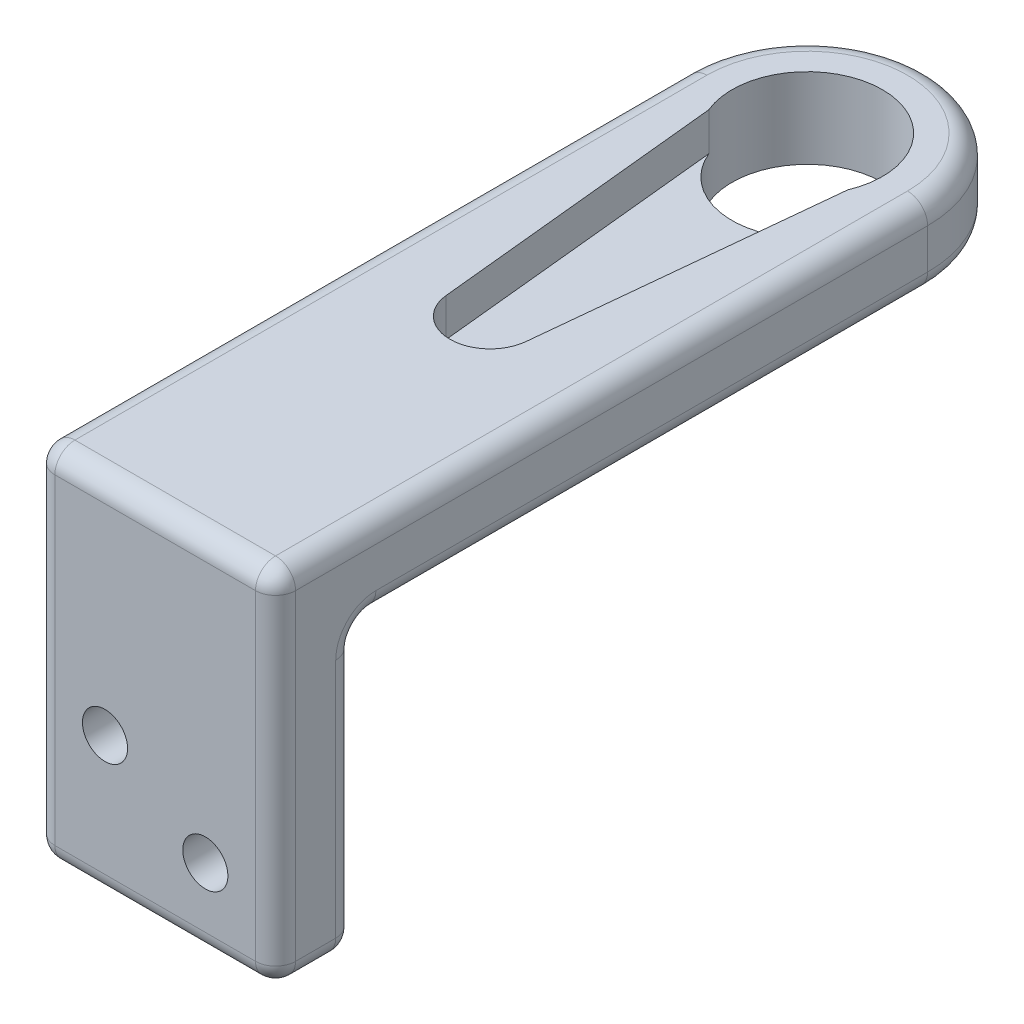
ISO-10303-21;
HEADER;
FILE_DESCRIPTION(('STEP AP214'),'2;1');
FILE_NAME('part.step','',(''),(''),'','','');
FILE_SCHEMA(('AUTOMOTIVE_DESIGN { 1 0 10303 214 1 1 1 1 }'));
ENDSEC;
DATA;
#1=APPLICATION_CONTEXT('core data for automotive mechanical design processes');
#2=APPLICATION_PROTOCOL_DEFINITION('international standard','automotive_design',2000,#1);
#3=PRODUCT_CONTEXT('',#1,'mechanical');
#4=PRODUCT('Part','Part','',(#3));
#5=PRODUCT_RELATED_PRODUCT_CATEGORY('part','',(#4));
#6=PRODUCT_DEFINITION_FORMATION('','',#4);
#7=PRODUCT_DEFINITION_CONTEXT('part definition',#1,'design');
#8=PRODUCT_DEFINITION('design','',#6,#7);
#9=PRODUCT_DEFINITION_SHAPE('','',#8);
#10=(LENGTH_UNIT() NAMED_UNIT(*) SI_UNIT(.MILLI.,.METRE.));
#11=(NAMED_UNIT(*) PLANE_ANGLE_UNIT() SI_UNIT($,.RADIAN.));
#12=(NAMED_UNIT(*) SI_UNIT($,.STERADIAN.) SOLID_ANGLE_UNIT());
#13=UNCERTAINTY_MEASURE_WITH_UNIT(LENGTH_MEASURE(1.E-05),#10,'distance_accuracy_value','');
#14=(GEOMETRIC_REPRESENTATION_CONTEXT(3) GLOBAL_UNCERTAINTY_ASSIGNED_CONTEXT((#13)) GLOBAL_UNIT_ASSIGNED_CONTEXT((#10,
#11,#12)) REPRESENTATION_CONTEXT('',''));
#15=CARTESIAN_POINT('',(0.,0.,0.));
#16=DIRECTION('',(0.,0.,1.));
#17=DIRECTION('',(1.,0.,0.));
#18=AXIS2_PLACEMENT_3D('',#15,#16,#17);
#19=CARTESIAN_POINT('',(0.,4.,0.));
#20=DIRECTION('',(0.,-1.,0.));
#21=DIRECTION('',(0.,0.,-1.));
#22=AXIS2_PLACEMENT_3D('',#19,#20,#21);
#23=CYLINDRICAL_SURFACE('',#22,6.);
#24=DIRECTION('',(0.,-1.,0.));
#25=VECTOR('',#24,1.);
#26=CARTESIAN_POINT('',(-6.,4.,0.));
#27=LINE('',#26,#25);
#28=CARTESIAN_POINT('',(-6.,3.,0.));
#29=VERTEX_POINT('',#28);
#30=CARTESIAN_POINT('',(-6.,1.,0.));
#31=VERTEX_POINT('',#30);
#32=EDGE_CURVE('E234',#29,#31,#27,.T.);
#33=ORIENTED_EDGE('',*,*,#32,.F.);
#34=CARTESIAN_POINT('',(0.,3.,0.));
#35=DIRECTION('',(0.,-1.,0.));
#36=DIRECTION('',(0.,0.,-1.));
#37=AXIS2_PLACEMENT_3D('',#34,#35,#36);
#38=CIRCLE('',#37,6.);
#39=CARTESIAN_POINT('',(6.,3.,0.));
#40=VERTEX_POINT('',#39);
#41=EDGE_CURVE('E306',#29,#40,#38,.T.);
#42=ORIENTED_EDGE('',*,*,#41,.T.);
#43=DIRECTION('',(0.,-1.,0.));
#44=VECTOR('',#43,1.);
#45=CARTESIAN_POINT('',(6.,4.,0.));
#46=LINE('',#45,#44);
#47=CARTESIAN_POINT('',(6.,1.,0.));
#48=VERTEX_POINT('',#47);
#49=EDGE_CURVE('E225',#40,#48,#46,.T.);
#50=ORIENTED_EDGE('',*,*,#49,.T.);
#51=CARTESIAN_POINT('',(0.,1.,0.));
#52=DIRECTION('',(0.,-1.,0.));
#53=DIRECTION('',(0.,0.,-1.));
#54=AXIS2_PLACEMENT_3D('',#51,#52,#53);
#55=CIRCLE('',#54,6.);
#56=EDGE_CURVE('E303',#48,#31,#55,.F.);
#57=ORIENTED_EDGE('',*,*,#56,.T.);
#58=EDGE_LOOP('',(#33,#42,#50,#57));
#59=FACE_BOUND('',#58,.T.);
#60=ADVANCED_FACE('F43',(#59),#23,.T.);
#61=CARTESIAN_POINT('',(-6.,4.,0.));
#62=DIRECTION('',(1.,0.,0.));
#63=DIRECTION('',(0.,0.,-1.));
#64=AXIS2_PLACEMENT_3D('',#61,#62,#63);
#65=PLANE('',#64);
#66=DIRECTION('',(0.,-1.,0.));
#67=VECTOR('',#66,1.);
#68=CARTESIAN_POINT('',(-5.99999999999999,4.,31.5));
#69=LINE('',#68,#67);
#70=CARTESIAN_POINT('',(-5.99999999999999,-13.,31.5));
#71=VERTEX_POINT('',#70);
#72=CARTESIAN_POINT('',(-5.99999999999999,3.,31.5));
#73=VERTEX_POINT('',#72);
#74=EDGE_CURVE('E284',#71,#73,#69,.F.);
#75=ORIENTED_EDGE('',*,*,#74,.T.);
#76=DIRECTION('',(0.,0.,1.));
#77=VECTOR('',#76,1.);
#78=CARTESIAN_POINT('',(-6.,3.,0.));
#79=LINE('',#78,#77);
#80=EDGE_CURVE('E287',#73,#29,#79,.F.);
#81=ORIENTED_EDGE('',*,*,#80,.T.);
#82=ORIENTED_EDGE('',*,*,#32,.T.);
#83=DIRECTION('',(0.,0.,1.));
#84=VECTOR('',#83,1.);
#85=CARTESIAN_POINT('',(-6.,1.,28.5));
#86=LINE('',#85,#84);
#87=CARTESIAN_POINT('',(-6.,1.,27.5));
#88=VERTEX_POINT('',#87);
#89=EDGE_CURVE('E275',#31,#88,#86,.T.);
#90=ORIENTED_EDGE('',*,*,#89,.T.);
#91=CARTESIAN_POINT('',(-6.,-0.999999999999999,27.5));
#92=DIRECTION('',(1.,0.,0.));
#93=DIRECTION('',(0.,0.,-1.));
#94=AXIS2_PLACEMENT_3D('',#91,#92,#93);
#95=CIRCLE('',#94,2.);
#96=CARTESIAN_POINT('',(-6.,-0.999999999999999,29.5));
#97=VERTEX_POINT('',#96);
#98=EDGE_CURVE('E271',#97,#88,#95,.F.);
#99=ORIENTED_EDGE('',*,*,#98,.F.);
#100=DIRECTION('',(0.,1.,0.));
#101=VECTOR('',#100,1.);
#102=CARTESIAN_POINT('',(-6.,4.,29.5));
#103=LINE('',#102,#101);
#104=CARTESIAN_POINT('',(-6.,-13.,29.5));
#105=VERTEX_POINT('',#104);
#106=EDGE_CURVE('E278',#97,#105,#103,.F.);
#107=ORIENTED_EDGE('',*,*,#106,.T.);
#108=DIRECTION('',(0.,0.,-1.));
#109=VECTOR('',#108,1.);
#110=CARTESIAN_POINT('',(-5.99999999999999,-13.,32.5));
#111=LINE('',#110,#109);
#112=EDGE_CURVE('E281',#105,#71,#111,.F.);
#113=ORIENTED_EDGE('',*,*,#112,.T.);
#114=EDGE_LOOP('',(#75,#81,#82,#90,#99,#107,#113));
#115=FACE_BOUND('',#114,.T.);
#116=ADVANCED_FACE('F506',(#115),#65,.F.);
#117=CARTESIAN_POINT('',(-5.99999999999999,4.,32.5));
#118=DIRECTION('',(0.,0.,-1.));
#119=DIRECTION('',(-1.,0.,0.));
#120=AXIS2_PLACEMENT_3D('',#117,#118,#119);
#121=PLANE('',#120);
#122=DIRECTION('',(0.,-1.,0.));
#123=VECTOR('',#122,1.);
#124=CARTESIAN_POINT('',(5.,4.,32.5));
#125=LINE('',#124,#123);
#126=CARTESIAN_POINT('',(5.,-13.,32.5));
#127=VERTEX_POINT('',#126);
#128=CARTESIAN_POINT('',(5.,3.,32.5));
#129=VERTEX_POINT('',#128);
#130=EDGE_CURVE('E328',#127,#129,#125,.F.);
#131=ORIENTED_EDGE('',*,*,#130,.T.);
#132=DIRECTION('',(1.,0.,0.));
#133=VECTOR('',#132,1.);
#134=CARTESIAN_POINT('',(-5.99999999999999,3.,32.5));
#135=LINE('',#134,#133);
#136=CARTESIAN_POINT('',(-4.99999999999999,3.,32.5));
#137=VERTEX_POINT('',#136);
#138=EDGE_CURVE('E331',#129,#137,#135,.F.);
#139=ORIENTED_EDGE('',*,*,#138,.T.);
#140=DIRECTION('',(0.,-1.,0.));
#141=VECTOR('',#140,1.);
#142=CARTESIAN_POINT('',(-4.99999999999999,4.,32.5));
#143=LINE('',#142,#141);
#144=CARTESIAN_POINT('',(-4.99999999999999,-13.,32.5));
#145=VERTEX_POINT('',#144);
#146=EDGE_CURVE('E325',#137,#145,#143,.T.);
#147=ORIENTED_EDGE('',*,*,#146,.T.);
#148=DIRECTION('',(-1.,0.,0.));
#149=VECTOR('',#148,1.);
#150=CARTESIAN_POINT('',(6.,-13.,32.5));
#151=LINE('',#150,#149);
#152=EDGE_CURVE('E322',#145,#127,#151,.F.);
#153=ORIENTED_EDGE('',*,*,#152,.T.);
#154=EDGE_LOOP('',(#131,#139,#147,#153));
#155=FACE_BOUND('',#154,.T.);
#156=CARTESIAN_POINT('',(2.5,-10.,32.5));
#157=DIRECTION('',(0.,0.,-1.));
#158=DIRECTION('',(-1.,0.,0.));
#159=AXIS2_PLACEMENT_3D('',#156,#157,#158);
#160=CIRCLE('',#159,1.125);
#161=CARTESIAN_POINT('',(1.375,-10.,32.5));
#162=VERTEX_POINT('',#161);
#163=EDGE_CURVE('E466',#162,#162,#160,.F.);
#164=ORIENTED_EDGE('',*,*,#163,.F.);
#165=EDGE_LOOP('',(#164));
#166=FACE_BOUND('',#165,.T.);
#167=CARTESIAN_POINT('',(-2.5,-7.,32.5));
#168=DIRECTION('',(0.,0.,-1.));
#169=DIRECTION('',(-1.,0.,0.));
#170=AXIS2_PLACEMENT_3D('',#167,#168,#169);
#171=CIRCLE('',#170,1.125);
#172=CARTESIAN_POINT('',(-3.625,-7.,32.5));
#173=VERTEX_POINT('',#172);
#174=EDGE_CURVE('E450',#173,#173,#171,.F.);
#175=ORIENTED_EDGE('',*,*,#174,.F.);
#176=EDGE_LOOP('',(#175));
#177=FACE_BOUND('',#176,.T.);
#178=ADVANCED_FACE('F501',(#155,#166,#177),#121,.F.);
#179=CARTESIAN_POINT('',(6.,4.,32.5));
#180=DIRECTION('',(-1.,0.,0.));
#181=DIRECTION('',(0.,0.,1.));
#182=AXIS2_PLACEMENT_3D('',#179,#180,#181);
#183=PLANE('',#182);
#184=CARTESIAN_POINT('',(6.,-0.999999999999999,27.5));
#185=DIRECTION('',(-1.,0.,0.));
#186=DIRECTION('',(0.,0.,1.));
#187=AXIS2_PLACEMENT_3D('',#184,#185,#186);
#188=CIRCLE('',#187,2.);
#189=CARTESIAN_POINT('',(6.,1.,27.5));
#190=VERTEX_POINT('',#189);
#191=CARTESIAN_POINT('',(6.,-0.999999999999999,29.5));
#192=VERTEX_POINT('',#191);
#193=EDGE_CURVE('E251',#190,#192,#188,.F.);
#194=ORIENTED_EDGE('',*,*,#193,.F.);
#195=DIRECTION('',(0.,0.,-1.));
#196=VECTOR('',#195,1.);
#197=CARTESIAN_POINT('',(6.,1.,0.));
#198=LINE('',#197,#196);
#199=EDGE_CURVE('E255',#190,#48,#198,.T.);
#200=ORIENTED_EDGE('',*,*,#199,.T.);
#201=ORIENTED_EDGE('',*,*,#49,.F.);
#202=DIRECTION('',(0.,0.,-1.));
#203=VECTOR('',#202,1.);
#204=CARTESIAN_POINT('',(6.,3.,32.5));
#205=LINE('',#204,#203);
#206=CARTESIAN_POINT('',(6.,3.,31.5));
#207=VERTEX_POINT('',#206);
#208=EDGE_CURVE('E244',#40,#207,#205,.F.);
#209=ORIENTED_EDGE('',*,*,#208,.T.);
#210=DIRECTION('',(0.,-1.,0.));
#211=VECTOR('',#210,1.);
#212=CARTESIAN_POINT('',(6.,4.,31.5));
#213=LINE('',#212,#211);
#214=CARTESIAN_POINT('',(6.,-13.,31.5));
#215=VERTEX_POINT('',#214);
#216=EDGE_CURVE('E241',#207,#215,#213,.T.);
#217=ORIENTED_EDGE('',*,*,#216,.T.);
#218=DIRECTION('',(0.,0.,1.));
#219=VECTOR('',#218,1.);
#220=CARTESIAN_POINT('',(6.,-13.,28.5));
#221=LINE('',#220,#219);
#222=CARTESIAN_POINT('',(6.,-13.,29.5));
#223=VERTEX_POINT('',#222);
#224=EDGE_CURVE('E238',#215,#223,#221,.F.);
#225=ORIENTED_EDGE('',*,*,#224,.T.);
#226=DIRECTION('',(0.,1.,0.));
#227=VECTOR('',#226,1.);
#228=CARTESIAN_POINT('',(6.,4.,29.5));
#229=LINE('',#228,#227);
#230=EDGE_CURVE('E247',#223,#192,#229,.T.);
#231=ORIENTED_EDGE('',*,*,#230,.T.);
#232=EDGE_LOOP('',(#194,#200,#201,#209,#217,#225,#231));
#233=FACE_BOUND('',#232,.T.);
#234=ADVANCED_FACE('F492',(#233),#183,.F.);
#235=CARTESIAN_POINT('',(0.,4.,0.));
#236=DIRECTION('',(0.,-1.,0.));
#237=DIRECTION('',(0.,0.,-1.));
#238=AXIS2_PLACEMENT_3D('',#235,#236,#237);
#239=PLANE('',#238);
#240=DIRECTION('',(1.,0.,0.));
#241=VECTOR('',#240,1.);
#242=CARTESIAN_POINT('',(0.,4.,31.5));
#243=LINE('',#242,#241);
#244=CARTESIAN_POINT('',(-4.99999999999999,4.,31.5));
#245=VERTEX_POINT('',#244);
#246=CARTESIAN_POINT('',(5.,4.,31.5));
#247=VERTEX_POINT('',#246);
#248=EDGE_CURVE('E293',#245,#247,#243,.T.);
#249=ORIENTED_EDGE('',*,*,#248,.T.);
#250=DIRECTION('',(0.,0.,-1.));
#251=VECTOR('',#250,1.);
#252=CARTESIAN_POINT('',(5.,4.,0.));
#253=LINE('',#252,#251);
#254=CARTESIAN_POINT('',(5.,4.,0.));
#255=VERTEX_POINT('',#254);
#256=EDGE_CURVE('E299',#247,#255,#253,.T.);
#257=ORIENTED_EDGE('',*,*,#256,.T.);
#258=CARTESIAN_POINT('',(0.,4.,0.));
#259=DIRECTION('',(0.,-1.,0.));
#260=DIRECTION('',(0.,0.,-1.));
#261=AXIS2_PLACEMENT_3D('',#258,#259,#260);
#262=CIRCLE('',#261,5.);
#263=CARTESIAN_POINT('',(-5.,4.,0.));
#264=VERTEX_POINT('',#263);
#265=EDGE_CURVE('E296',#255,#264,#262,.F.);
#266=ORIENTED_EDGE('',*,*,#265,.T.);
#267=DIRECTION('',(0.,0.,1.));
#268=VECTOR('',#267,1.);
#269=CARTESIAN_POINT('',(-5.,4.,0.));
#270=LINE('',#269,#268);
#271=EDGE_CURVE('E290',#264,#245,#270,.T.);
#272=ORIENTED_EDGE('',*,*,#271,.T.);
#273=EDGE_LOOP('',(#249,#257,#266,#272));
#274=FACE_BOUND('',#273,.T.);
#275=CARTESIAN_POINT('',(0.,4.,0.));
#276=DIRECTION('',(0.,1.,0.));
#277=DIRECTION('',(0.,0.,1.));
#278=AXIS2_PLACEMENT_3D('',#275,#276,#277);
#279=CIRCLE('',#278,3.75);
#280=CARTESIAN_POINT('',(3.45999999999994,4.,1.4459944674861));
#281=VERTEX_POINT('',#280);
#282=CARTESIAN_POINT('',(-3.46,4.,1.44599446748596));
#283=VERTEX_POINT('',#282);
#284=EDGE_CURVE('E213',#281,#283,#279,.T.);
#285=ORIENTED_EDGE('',*,*,#284,.F.);
#286=DIRECTION('',(0.1004588297189,0.,-0.994941216118575));
#287=VECTOR('',#286,1.);
#288=CARTESIAN_POINT('',(3.45999999999994,4.,1.4459944674861));
#289=LINE('',#288,#287);
#290=CARTESIAN_POINT('',(1.98988243223717,4.,16.0059944674861));
#291=VERTEX_POINT('',#290);
#292=EDGE_CURVE('E208',#291,#281,#289,.T.);
#293=ORIENTED_EDGE('',*,*,#292,.F.);
#294=CARTESIAN_POINT('',(0.,4.,15.8050768080483));
#295=DIRECTION('',(0.,1.,0.));
#296=DIRECTION('',(0.,0.,1.));
#297=AXIS2_PLACEMENT_3D('',#294,#295,#296);
#298=CIRCLE('',#297,2.00000000000002);
#299=CARTESIAN_POINT('',(-1.98988243223721,4.,16.005994467486));
#300=VERTEX_POINT('',#299);
#301=EDGE_CURVE('E474',#300,#291,#298,.T.);
#302=ORIENTED_EDGE('',*,*,#301,.F.);
#303=DIRECTION('',(0.100458829718901,0.,0.994941216118575));
#304=VECTOR('',#303,1.);
#305=CARTESIAN_POINT('',(-3.46,4.,1.44599446748596));
#306=LINE('',#305,#304);
#307=EDGE_CURVE('E471',#283,#300,#306,.T.);
#308=ORIENTED_EDGE('',*,*,#307,.F.);
#309=EDGE_LOOP('',(#285,#293,#302,#308));
#310=FACE_BOUND('',#309,.T.);
#311=ADVANCED_FACE('F489',(#274,#310),#239,.F.);
#312=CARTESIAN_POINT('',(0.,0.,0.));
#313=DIRECTION('',(0.,-1.,0.));
#314=DIRECTION('',(0.,0.,-1.));
#315=AXIS2_PLACEMENT_3D('',#312,#313,#314);
#316=PLANE('',#315);
#317=CARTESIAN_POINT('',(0.,0.,0.));
#318=DIRECTION('',(0.,-1.,0.));
#319=DIRECTION('',(0.,0.,-1.));
#320=AXIS2_PLACEMENT_3D('',#317,#318,#319);
#321=CIRCLE('',#320,5.);
#322=CARTESIAN_POINT('',(-5.,0.,0.));
#323=VERTEX_POINT('',#322);
#324=CARTESIAN_POINT('',(5.,0.,0.));
#325=VERTEX_POINT('',#324);
#326=EDGE_CURVE('E315',#323,#325,#321,.T.);
#327=ORIENTED_EDGE('',*,*,#326,.T.);
#328=DIRECTION('',(0.,0.,-1.));
#329=VECTOR('',#328,1.);
#330=CARTESIAN_POINT('',(5.,0.,28.5));
#331=LINE('',#330,#329);
#332=CARTESIAN_POINT('',(5.,0.,27.5));
#333=VERTEX_POINT('',#332);
#334=EDGE_CURVE('E318',#325,#333,#331,.F.);
#335=ORIENTED_EDGE('',*,*,#334,.T.);
#336=DIRECTION('',(1.,0.,0.));
#337=VECTOR('',#336,1.);
#338=CARTESIAN_POINT('',(0.,0.,27.5));
#339=LINE('',#338,#337);
#340=CARTESIAN_POINT('',(-5.,0.,27.5));
#341=VERTEX_POINT('',#340);
#342=EDGE_CURVE('E309',#333,#341,#339,.F.);
#343=ORIENTED_EDGE('',*,*,#342,.T.);
#344=DIRECTION('',(0.,0.,1.));
#345=VECTOR('',#344,1.);
#346=CARTESIAN_POINT('',(-5.,0.,0.));
#347=LINE('',#346,#345);
#348=EDGE_CURVE('E312',#341,#323,#347,.F.);
#349=ORIENTED_EDGE('',*,*,#348,.T.);
#350=EDGE_LOOP('',(#327,#335,#343,#349));
#351=FACE_BOUND('',#350,.T.);
#352=CARTESIAN_POINT('',(0.,0.,0.));
#353=DIRECTION('',(0.,-1.,0.));
#354=DIRECTION('',(0.,0.,-1.));
#355=AXIS2_PLACEMENT_3D('',#352,#353,#354);
#356=CIRCLE('',#355,3.75);
#357=CARTESIAN_POINT('',(0.,0.,-3.75));
#358=VERTEX_POINT('',#357);
#359=EDGE_CURVE('E226',#358,#358,#356,.F.);
#360=ORIENTED_EDGE('',*,*,#359,.T.);
#361=EDGE_LOOP('',(#360));
#362=FACE_BOUND('',#361,.T.);
#363=ADVANCED_FACE('F491',(#351,#362),#316,.T.);
#364=CARTESIAN_POINT('',(0.,-0.00100000000000013,0.));
#365=DIRECTION('',(0.,1.,0.));
#366=DIRECTION('',(0.,0.,1.));
#367=AXIS2_PLACEMENT_3D('',#364,#365,#366);
#368=CYLINDRICAL_SURFACE('',#367,3.75);
#369=ORIENTED_EDGE('',*,*,#359,.F.);
#370=EDGE_LOOP('',(#369));
#371=FACE_BOUND('',#370,.T.);
#372=CARTESIAN_POINT('',(0.,2.1,0.));
#373=DIRECTION('',(0.,-1.,0.));
#374=DIRECTION('',(0.,0.,1.));
#375=AXIS2_PLACEMENT_3D('',#372,#373,#374);
#376=CIRCLE('',#375,3.75);
#377=CARTESIAN_POINT('',(3.45999999999994,2.1,1.4459944674861));
#378=VERTEX_POINT('',#377);
#379=CARTESIAN_POINT('',(-3.46,2.1,1.44599446748596));
#380=VERTEX_POINT('',#379);
#381=EDGE_CURVE('E198',#378,#380,#376,.T.);
#382=ORIENTED_EDGE('',*,*,#381,.F.);
#383=DIRECTION('',(0.,1.,0.));
#384=VECTOR('',#383,1.);
#385=CARTESIAN_POINT('',(3.45999999999994,2.1,1.4459944674861));
#386=LINE('',#385,#384);
#387=EDGE_CURVE('E230',#378,#281,#386,.T.);
#388=ORIENTED_EDGE('',*,*,#387,.T.);
#389=ORIENTED_EDGE('',*,*,#284,.T.);
#390=DIRECTION('',(0.,1.,0.));
#391=VECTOR('',#390,1.);
#392=CARTESIAN_POINT('',(-3.46,2.1,1.44599446748596));
#393=LINE('',#392,#391);
#394=EDGE_CURVE('E190',#380,#283,#393,.T.);
#395=ORIENTED_EDGE('',*,*,#394,.F.);
#396=EDGE_LOOP('',(#382,#388,#389,#395));
#397=FACE_BOUND('',#396,.T.);
#398=ADVANCED_FACE('F211',(#371,#397),#368,.F.);
#399=CARTESIAN_POINT('',(3.45999999999994,2.1,1.4459944674861));
#400=DIRECTION('',(0.994941216118575,0.,0.1004588297189));
#401=DIRECTION('',(0.1004588297189,0.,-0.994941216118575));
#402=AXIS2_PLACEMENT_3D('',#399,#400,#401);
#403=PLANE('',#402);
#404=ORIENTED_EDGE('',*,*,#292,.T.);
#405=ORIENTED_EDGE('',*,*,#387,.F.);
#406=DIRECTION('',(0.1004588297189,0.,-0.994941216118575));
#407=VECTOR('',#406,1.);
#408=CARTESIAN_POINT('',(3.45999999999994,2.1,1.4459944674861));
#409=LINE('',#408,#407);
#410=CARTESIAN_POINT('',(1.98988243223717,2.1,16.0059944674861));
#411=VERTEX_POINT('',#410);
#412=EDGE_CURVE('E203',#411,#378,#409,.T.);
#413=ORIENTED_EDGE('',*,*,#412,.F.);
#414=DIRECTION('',(0.,1.,0.));
#415=VECTOR('',#414,1.);
#416=CARTESIAN_POINT('',(1.98988243223717,2.1,16.0059944674861));
#417=LINE('',#416,#415);
#418=EDGE_CURVE('E218',#411,#291,#417,.T.);
#419=ORIENTED_EDGE('',*,*,#418,.T.);
#420=EDGE_LOOP('',(#404,#405,#413,#419));
#421=FACE_BOUND('',#420,.T.);
#422=ADVANCED_FACE('F483',(#421),#403,.F.);
#423=CARTESIAN_POINT('',(0.,2.1,15.8050768080483));
#424=DIRECTION('',(0.,1.,0.));
#425=DIRECTION('',(0.,0.,1.));
#426=AXIS2_PLACEMENT_3D('',#423,#424,#425);
#427=CYLINDRICAL_SURFACE('',#426,2.00000000000002);
#428=ORIENTED_EDGE('',*,*,#301,.T.);
#429=ORIENTED_EDGE('',*,*,#418,.F.);
#430=CARTESIAN_POINT('',(0.,2.1,15.8050768080483));
#431=DIRECTION('',(0.,1.,0.));
#432=DIRECTION('',(0.,0.,1.));
#433=AXIS2_PLACEMENT_3D('',#430,#431,#432);
#434=CIRCLE('',#433,2.00000000000002);
#435=CARTESIAN_POINT('',(-1.98988243223721,2.1,16.005994467486));
#436=VERTEX_POINT('',#435);
#437=EDGE_CURVE('E197',#436,#411,#434,.T.);
#438=ORIENTED_EDGE('',*,*,#437,.F.);
#439=DIRECTION('',(0.,1.,0.));
#440=VECTOR('',#439,1.);
#441=CARTESIAN_POINT('',(-1.98988243223721,2.1,16.005994467486));
#442=LINE('',#441,#440);
#443=EDGE_CURVE('E192',#436,#300,#442,.T.);
#444=ORIENTED_EDGE('',*,*,#443,.T.);
#445=EDGE_LOOP('',(#428,#429,#438,#444));
#446=FACE_BOUND('',#445,.T.);
#447=ADVANCED_FACE('F487',(#446),#427,.F.);
#448=CARTESIAN_POINT('',(-3.46,2.1,1.44599446748596));
#449=DIRECTION('',(-0.994941216118575,0.,0.100458829718901));
#450=DIRECTION('',(0.100458829718901,0.,0.994941216118575));
#451=AXIS2_PLACEMENT_3D('',#448,#449,#450);
#452=PLANE('',#451);
#453=ORIENTED_EDGE('',*,*,#307,.T.);
#454=ORIENTED_EDGE('',*,*,#443,.F.);
#455=DIRECTION('',(0.100458829718901,0.,0.994941216118575));
#456=VECTOR('',#455,1.);
#457=CARTESIAN_POINT('',(-3.46,2.1,1.44599446748596));
#458=LINE('',#457,#456);
#459=EDGE_CURVE('E185',#380,#436,#458,.T.);
#460=ORIENTED_EDGE('',*,*,#459,.F.);
#461=ORIENTED_EDGE('',*,*,#394,.T.);
#462=EDGE_LOOP('',(#453,#454,#460,#461));
#463=FACE_BOUND('',#462,.T.);
#464=ADVANCED_FACE('F188',(#463),#452,.F.);
#465=CARTESIAN_POINT('',(0.,2.1,0.));
#466=DIRECTION('',(0.,1.,0.));
#467=DIRECTION('',(0.,0.,1.));
#468=AXIS2_PLACEMENT_3D('',#465,#466,#467);
#469=PLANE('',#468);
#470=ORIENTED_EDGE('',*,*,#381,.T.);
#471=ORIENTED_EDGE('',*,*,#459,.T.);
#472=ORIENTED_EDGE('',*,*,#437,.T.);
#473=ORIENTED_EDGE('',*,*,#412,.T.);
#474=EDGE_LOOP('',(#470,#471,#472,#473));
#475=FACE_BOUND('',#474,.T.);
#476=ADVANCED_FACE('F201',(#475),#469,.T.);
#477=CARTESIAN_POINT('',(-5.99999999999999,-14.,28.5));
#478=DIRECTION('',(0.,0.,1.));
#479=DIRECTION('',(1.,0.,0.));
#480=AXIS2_PLACEMENT_3D('',#477,#478,#479);
#481=PLANE('',#480);
#482=DIRECTION('',(0.,1.,0.));
#483=VECTOR('',#482,1.);
#484=CARTESIAN_POINT('',(5.,-14.,28.5));
#485=LINE('',#484,#483);
#486=CARTESIAN_POINT('',(5.,-0.999999999999999,28.5));
#487=VERTEX_POINT('',#486);
#488=CARTESIAN_POINT('',(5.,-13.,28.5));
#489=VERTEX_POINT('',#488);
#490=EDGE_CURVE('E264',#487,#489,#485,.F.);
#491=ORIENTED_EDGE('',*,*,#490,.T.);
#492=DIRECTION('',(1.,0.,0.));
#493=VECTOR('',#492,1.);
#494=CARTESIAN_POINT('',(-5.99999999999999,-13.,28.5));
#495=LINE('',#494,#493);
#496=CARTESIAN_POINT('',(-5.,-13.,28.5));
#497=VERTEX_POINT('',#496);
#498=EDGE_CURVE('E268',#489,#497,#495,.F.);
#499=ORIENTED_EDGE('',*,*,#498,.T.);
#500=DIRECTION('',(0.,1.,0.));
#501=VECTOR('',#500,1.);
#502=CARTESIAN_POINT('',(-5.,-14.,28.5));
#503=LINE('',#502,#501);
#504=CARTESIAN_POINT('',(-5.,-0.999999999999999,28.5));
#505=VERTEX_POINT('',#504);
#506=EDGE_CURVE('E261',#497,#505,#503,.T.);
#507=ORIENTED_EDGE('',*,*,#506,.T.);
#508=DIRECTION('',(1.,0.,0.));
#509=VECTOR('',#508,1.);
#510=CARTESIAN_POINT('',(-5.99999999999999,-0.999999999999999,28.5));
#511=LINE('',#510,#509);
#512=EDGE_CURVE('E258',#505,#487,#511,.T.);
#513=ORIENTED_EDGE('',*,*,#512,.T.);
#514=EDGE_LOOP('',(#491,#499,#507,#513));
#515=FACE_BOUND('',#514,.T.);
#516=CARTESIAN_POINT('',(2.5,-10.,28.5));
#517=DIRECTION('',(0.,0.,-1.));
#518=DIRECTION('',(-1.,0.,0.));
#519=AXIS2_PLACEMENT_3D('',#516,#517,#518);
#520=CIRCLE('',#519,1.125);
#521=CARTESIAN_POINT('',(1.375,-10.,28.5));
#522=VERTEX_POINT('',#521);
#523=EDGE_CURVE('E463',#522,#522,#520,.T.);
#524=ORIENTED_EDGE('',*,*,#523,.F.);
#525=EDGE_LOOP('',(#524));
#526=FACE_BOUND('',#525,.T.);
#527=CARTESIAN_POINT('',(-2.5,-7.,28.5));
#528=DIRECTION('',(0.,0.,-1.));
#529=DIRECTION('',(-1.,0.,0.));
#530=AXIS2_PLACEMENT_3D('',#527,#528,#529);
#531=CIRCLE('',#530,1.125);
#532=CARTESIAN_POINT('',(-3.625,-7.,28.5));
#533=VERTEX_POINT('',#532);
#534=EDGE_CURVE('E457',#533,#533,#531,.T.);
#535=ORIENTED_EDGE('',*,*,#534,.F.);
#536=EDGE_LOOP('',(#535));
#537=FACE_BOUND('',#536,.T.);
#538=ADVANCED_FACE('F644',(#515,#526,#537),#481,.F.);
#539=CARTESIAN_POINT('',(0.,-14.,0.));
#540=DIRECTION('',(0.,-1.,0.));
#541=DIRECTION('',(0.,0.,-1.));
#542=AXIS2_PLACEMENT_3D('',#539,#540,#541);
#543=PLANE('',#542);
#544=DIRECTION('',(0.,0.,1.));
#545=VECTOR('',#544,1.);
#546=CARTESIAN_POINT('',(5.,-14.,32.5));
#547=LINE('',#546,#545);
#548=CARTESIAN_POINT('',(5.,-14.,29.5));
#549=VERTEX_POINT('',#548);
#550=CARTESIAN_POINT('',(5.,-14.,31.5));
#551=VERTEX_POINT('',#550);
#552=EDGE_CURVE('E53',#549,#551,#547,.T.);
#553=ORIENTED_EDGE('',*,*,#552,.T.);
#554=DIRECTION('',(-1.,0.,0.));
#555=VECTOR('',#554,1.);
#556=CARTESIAN_POINT('',(-5.99999999999999,-14.,31.5));
#557=LINE('',#556,#555);
#558=CARTESIAN_POINT('',(-4.99999999999999,-14.,31.5));
#559=VERTEX_POINT('',#558);
#560=EDGE_CURVE('E11',#551,#559,#557,.T.);
#561=ORIENTED_EDGE('',*,*,#560,.T.);
#562=DIRECTION('',(0.,0.,-1.));
#563=VECTOR('',#562,1.);
#564=CARTESIAN_POINT('',(-5.,-14.,28.5));
#565=LINE('',#564,#563);
#566=CARTESIAN_POINT('',(-5.,-14.,29.5));
#567=VERTEX_POINT('',#566);
#568=EDGE_CURVE('E335',#559,#567,#565,.T.);
#569=ORIENTED_EDGE('',*,*,#568,.T.);
#570=DIRECTION('',(1.,0.,0.));
#571=VECTOR('',#570,1.);
#572=CARTESIAN_POINT('',(6.,-14.,29.5));
#573=LINE('',#572,#571);
#574=EDGE_CURVE('E64',#567,#549,#573,.T.);
#575=ORIENTED_EDGE('',*,*,#574,.T.);
#576=EDGE_LOOP('',(#553,#561,#569,#575));
#577=FACE_BOUND('',#576,.T.);
#578=ADVANCED_FACE('F659',(#577),#543,.T.);
#579=CARTESIAN_POINT('',(-2.5,-7.,32.501));
#580=DIRECTION('',(0.,0.,-1.));
#581=DIRECTION('',(-1.,0.,0.));
#582=AXIS2_PLACEMENT_3D('',#579,#580,#581);
#583=CYLINDRICAL_SURFACE('',#582,1.125);
#584=ORIENTED_EDGE('',*,*,#534,.T.);
#585=EDGE_LOOP('',(#584));
#586=FACE_BOUND('',#585,.T.);
#587=ORIENTED_EDGE('',*,*,#174,.T.);
#588=EDGE_LOOP('',(#587));
#589=FACE_BOUND('',#588,.T.);
#590=ADVANCED_FACE('F682',(#586,#589),#583,.F.);
#591=CARTESIAN_POINT('',(2.5,-10.,32.501));
#592=DIRECTION('',(0.,0.,-1.));
#593=DIRECTION('',(-1.,0.,0.));
#594=AXIS2_PLACEMENT_3D('',#591,#592,#593);
#595=CYLINDRICAL_SURFACE('',#594,1.125);
#596=ORIENTED_EDGE('',*,*,#523,.T.);
#597=EDGE_LOOP('',(#596));
#598=FACE_BOUND('',#597,.T.);
#599=ORIENTED_EDGE('',*,*,#163,.T.);
#600=EDGE_LOOP('',(#599));
#601=FACE_BOUND('',#600,.T.);
#602=ADVANCED_FACE('F608',(#598,#601),#595,.F.);
#603=CARTESIAN_POINT('',(-5.,3.,0.));
#604=DIRECTION('',(0.,0.,1.));
#605=DIRECTION('',(1.,0.,0.));
#606=AXIS2_PLACEMENT_3D('',#603,#604,#605);
#607=CYLINDRICAL_SURFACE('',#606,1.);
#608=CARTESIAN_POINT('',(-4.99999999999999,3.,31.5));
#609=DIRECTION('',(0.,0.,1.));
#610=DIRECTION('',(1.,0.,0.));
#611=AXIS2_PLACEMENT_3D('',#608,#609,#610);
#612=CIRCLE('',#611,1.);
#613=EDGE_CURVE('E47',#245,#73,#612,.T.);
#614=ORIENTED_EDGE('',*,*,#613,.F.);
#615=ORIENTED_EDGE('',*,*,#271,.F.);
#616=CARTESIAN_POINT('',(-5.,3.,0.));
#617=DIRECTION('',(0.,0.,-1.));
#618=DIRECTION('',(-1.,0.,0.));
#619=AXIS2_PLACEMENT_3D('',#616,#617,#618);
#620=CIRCLE('',#619,1.);
#621=EDGE_CURVE('E441',#29,#264,#620,.T.);
#622=ORIENTED_EDGE('',*,*,#621,.F.);
#623=ORIENTED_EDGE('',*,*,#80,.F.);
#624=EDGE_LOOP('',(#614,#615,#622,#623));
#625=FACE_BOUND('',#624,.T.);
#626=ADVANCED_FACE('F45',(#625),#607,.T.);
#627=CARTESIAN_POINT('',(-4.99999999999999,3.,31.5));
#628=DIRECTION('',(-1.,0.,0.));
#629=DIRECTION('',(0.,0.,1.));
#630=AXIS2_PLACEMENT_3D('',#627,#628,#629);
#631=SPHERICAL_SURFACE('',#630,1.);
#632=CARTESIAN_POINT('',(-4.99999999999999,3.,31.5));
#633=DIRECTION('',(-1.,0.,0.));
#634=DIRECTION('',(0.,0.,1.));
#635=AXIS2_PLACEMENT_3D('',#632,#633,#634);
#636=CIRCLE('',#635,1.);
#637=EDGE_CURVE('E434',#245,#137,#636,.F.);
#638=ORIENTED_EDGE('',*,*,#637,.F.);
#639=ORIENTED_EDGE('',*,*,#613,.T.);
#640=CARTESIAN_POINT('',(-4.99999999999999,3.,31.5));
#641=DIRECTION('',(0.,1.,0.));
#642=DIRECTION('',(0.,0.,1.));
#643=AXIS2_PLACEMENT_3D('',#640,#641,#642);
#644=CIRCLE('',#643,1.);
#645=EDGE_CURVE('E438',#137,#73,#644,.F.);
#646=ORIENTED_EDGE('',*,*,#645,.F.);
#647=EDGE_LOOP('',(#638,#639,#646));
#648=FACE_BOUND('',#647,.T.);
#649=ADVANCED_FACE('F603',(#648),#631,.T.);
#650=CARTESIAN_POINT('',(0.,3.,0.));
#651=DIRECTION('',(0.,-1.,0.));
#652=DIRECTION('',(0.,0.,-1.));
#653=AXIS2_PLACEMENT_3D('',#650,#651,#652);
#654=TOROIDAL_SURFACE('',#653,5.,1.);
#655=ORIENTED_EDGE('',*,*,#621,.T.);
#656=ORIENTED_EDGE('',*,*,#265,.F.);
#657=CARTESIAN_POINT('',(5.,3.,0.));
#658=DIRECTION('',(0.,0.,1.));
#659=DIRECTION('',(0.,-1.,0.));
#660=AXIS2_PLACEMENT_3D('',#657,#658,#659);
#661=CIRCLE('',#660,1.);
#662=EDGE_CURVE('E431',#40,#255,#661,.T.);
#663=ORIENTED_EDGE('',*,*,#662,.F.);
#664=ORIENTED_EDGE('',*,*,#41,.F.);
#665=EDGE_LOOP('',(#655,#656,#663,#664));
#666=FACE_BOUND('',#665,.T.);
#667=ADVANCED_FACE('F600',(#666),#654,.T.);
#668=CARTESIAN_POINT('',(-4.99999999999999,4.,31.5));
#669=DIRECTION('',(0.,-1.,0.));
#670=DIRECTION('',(0.,0.,-1.));
#671=AXIS2_PLACEMENT_3D('',#668,#669,#670);
#672=CYLINDRICAL_SURFACE('',#671,1.);
#673=ORIENTED_EDGE('',*,*,#645,.T.);
#674=ORIENTED_EDGE('',*,*,#74,.F.);
#675=CARTESIAN_POINT('',(-4.99999999999999,-13.,31.5));
#676=DIRECTION('',(0.,-1.,0.));
#677=DIRECTION('',(0.,0.,-1.));
#678=AXIS2_PLACEMENT_3D('',#675,#676,#677);
#679=CIRCLE('',#678,1.);
#680=EDGE_CURVE('E427',#145,#71,#679,.T.);
#681=ORIENTED_EDGE('',*,*,#680,.F.);
#682=ORIENTED_EDGE('',*,*,#146,.F.);
#683=EDGE_LOOP('',(#673,#674,#681,#682));
#684=FACE_BOUND('',#683,.T.);
#685=ADVANCED_FACE('F596',(#684),#672,.T.);
#686=CARTESIAN_POINT('',(0.,3.,31.5));
#687=DIRECTION('',(1.,0.,0.));
#688=DIRECTION('',(0.,0.,-1.));
#689=AXIS2_PLACEMENT_3D('',#686,#687,#688);
#690=CYLINDRICAL_SURFACE('',#689,1.);
#691=ORIENTED_EDGE('',*,*,#637,.T.);
#692=ORIENTED_EDGE('',*,*,#138,.F.);
#693=CARTESIAN_POINT('',(5.,3.,31.5));
#694=DIRECTION('',(1.,0.,0.));
#695=DIRECTION('',(0.,0.,-1.));
#696=AXIS2_PLACEMENT_3D('',#693,#694,#695);
#697=CIRCLE('',#696,1.);
#698=EDGE_CURVE('E423',#247,#129,#697,.T.);
#699=ORIENTED_EDGE('',*,*,#698,.F.);
#700=ORIENTED_EDGE('',*,*,#248,.F.);
#701=EDGE_LOOP('',(#691,#692,#699,#700));
#702=FACE_BOUND('',#701,.T.);
#703=ADVANCED_FACE('F592',(#702),#690,.T.);
#704=CARTESIAN_POINT('',(5.,3.,0.));
#705=DIRECTION('',(0.,0.,-1.));
#706=DIRECTION('',(-1.,0.,0.));
#707=AXIS2_PLACEMENT_3D('',#704,#705,#706);
#708=CYLINDRICAL_SURFACE('',#707,1.);
#709=ORIENTED_EDGE('',*,*,#662,.T.);
#710=ORIENTED_EDGE('',*,*,#256,.F.);
#711=CARTESIAN_POINT('',(5.,3.,31.5));
#712=DIRECTION('',(0.,0.,1.));
#713=DIRECTION('',(1.,0.,0.));
#714=AXIS2_PLACEMENT_3D('',#711,#712,#713);
#715=CIRCLE('',#714,1.);
#716=EDGE_CURVE('E419',#207,#247,#715,.T.);
#717=ORIENTED_EDGE('',*,*,#716,.F.);
#718=ORIENTED_EDGE('',*,*,#208,.F.);
#719=EDGE_LOOP('',(#709,#710,#717,#718));
#720=FACE_BOUND('',#719,.T.);
#721=ADVANCED_FACE('F588',(#720),#708,.T.);
#722=CARTESIAN_POINT('',(-4.99999999999999,-13.,31.5));
#723=DIRECTION('',(-1.,0.,0.));
#724=DIRECTION('',(0.,0.,1.));
#725=AXIS2_PLACEMENT_3D('',#722,#723,#724);
#726=SPHERICAL_SURFACE('',#725,1.);
#727=CARTESIAN_POINT('',(-4.99999999999999,-13.,31.5));
#728=DIRECTION('',(-1.,0.,0.));
#729=DIRECTION('',(0.,0.,1.));
#730=AXIS2_PLACEMENT_3D('',#727,#728,#729);
#731=CIRCLE('',#730,1.);
#732=EDGE_CURVE('E411',#145,#559,#731,.F.);
#733=ORIENTED_EDGE('',*,*,#732,.F.);
#734=ORIENTED_EDGE('',*,*,#680,.T.);
#735=CARTESIAN_POINT('',(-4.99999999999999,-13.,31.5));
#736=DIRECTION('',(0.,0.,1.));
#737=DIRECTION('',(1.,0.,0.));
#738=AXIS2_PLACEMENT_3D('',#735,#736,#737);
#739=CIRCLE('',#738,1.);
#740=EDGE_CURVE('E415',#559,#71,#739,.F.);
#741=ORIENTED_EDGE('',*,*,#740,.F.);
#742=EDGE_LOOP('',(#733,#734,#741));
#743=FACE_BOUND('',#742,.T.);
#744=ADVANCED_FACE('F584',(#743),#726,.T.);
#745=CARTESIAN_POINT('',(5.,3.,31.5));
#746=DIRECTION('',(0.,1.,0.));
#747=DIRECTION('',(0.,0.,1.));
#748=AXIS2_PLACEMENT_3D('',#745,#746,#747);
#749=SPHERICAL_SURFACE('',#748,1.);
#750=ORIENTED_EDGE('',*,*,#716,.T.);
#751=ORIENTED_EDGE('',*,*,#698,.T.);
#752=CARTESIAN_POINT('',(5.,3.,31.5));
#753=DIRECTION('',(0.,1.,0.));
#754=DIRECTION('',(0.,0.,1.));
#755=AXIS2_PLACEMENT_3D('',#752,#753,#754);
#756=CIRCLE('',#755,1.);
#757=EDGE_CURVE('E407',#207,#129,#756,.F.);
#758=ORIENTED_EDGE('',*,*,#757,.F.);
#759=EDGE_LOOP('',(#750,#751,#758));
#760=FACE_BOUND('',#759,.T.);
#761=ADVANCED_FACE('F580',(#760),#749,.T.);
#762=CARTESIAN_POINT('',(-5.,-13.,0.));
#763=DIRECTION('',(0.,0.,1.));
#764=DIRECTION('',(1.,0.,0.));
#765=AXIS2_PLACEMENT_3D('',#762,#763,#764);
#766=CYLINDRICAL_SURFACE('',#765,1.);
#767=ORIENTED_EDGE('',*,*,#740,.T.);
#768=ORIENTED_EDGE('',*,*,#112,.F.);
#769=CARTESIAN_POINT('',(-5.,-13.,29.5));
#770=DIRECTION('',(0.,0.,-1.));
#771=DIRECTION('',(-1.,0.,0.));
#772=AXIS2_PLACEMENT_3D('',#769,#770,#771);
#773=CIRCLE('',#772,1.);
#774=EDGE_CURVE('E399',#567,#105,#773,.T.);
#775=ORIENTED_EDGE('',*,*,#774,.F.);
#776=ORIENTED_EDGE('',*,*,#568,.F.);
#777=EDGE_LOOP('',(#767,#768,#775,#776));
#778=FACE_BOUND('',#777,.T.);
#779=ADVANCED_FACE('F576',(#778),#766,.T.);
#780=CARTESIAN_POINT('',(0.,-13.,31.5));
#781=DIRECTION('',(1.,0.,0.));
#782=DIRECTION('',(0.,0.,-1.));
#783=AXIS2_PLACEMENT_3D('',#780,#781,#782);
#784=CYLINDRICAL_SURFACE('',#783,1.);
#785=ORIENTED_EDGE('',*,*,#732,.T.);
#786=ORIENTED_EDGE('',*,*,#560,.F.);
#787=CARTESIAN_POINT('',(5.,-13.,31.5));
#788=DIRECTION('',(1.,0.,0.));
#789=DIRECTION('',(0.,0.,-1.));
#790=AXIS2_PLACEMENT_3D('',#787,#788,#789);
#791=CIRCLE('',#790,1.);
#792=EDGE_CURVE('E395',#127,#551,#791,.T.);
#793=ORIENTED_EDGE('',*,*,#792,.F.);
#794=ORIENTED_EDGE('',*,*,#152,.F.);
#795=EDGE_LOOP('',(#785,#786,#793,#794));
#796=FACE_BOUND('',#795,.T.);
#797=ADVANCED_FACE('F572',(#796),#784,.T.);
#798=CARTESIAN_POINT('',(5.,4.,31.5));
#799=DIRECTION('',(0.,-1.,0.));
#800=DIRECTION('',(0.,0.,-1.));
#801=AXIS2_PLACEMENT_3D('',#798,#799,#800);
#802=CYLINDRICAL_SURFACE('',#801,1.);
#803=ORIENTED_EDGE('',*,*,#757,.T.);
#804=ORIENTED_EDGE('',*,*,#130,.F.);
#805=CARTESIAN_POINT('',(5.,-13.,31.5));
#806=DIRECTION('',(0.,-1.,0.));
#807=DIRECTION('',(0.,0.,-1.));
#808=AXIS2_PLACEMENT_3D('',#805,#806,#807);
#809=CIRCLE('',#808,1.);
#810=EDGE_CURVE('E391',#215,#127,#809,.T.);
#811=ORIENTED_EDGE('',*,*,#810,.F.);
#812=ORIENTED_EDGE('',*,*,#216,.F.);
#813=EDGE_LOOP('',(#803,#804,#811,#812));
#814=FACE_BOUND('',#813,.T.);
#815=ADVANCED_FACE('F568',(#814),#802,.T.);
#816=CARTESIAN_POINT('',(-5.,1.,0.));
#817=DIRECTION('',(0.,0.,-1.));
#818=DIRECTION('',(-1.,0.,0.));
#819=AXIS2_PLACEMENT_3D('',#816,#817,#818);
#820=CYLINDRICAL_SURFACE('',#819,1.);
#821=CARTESIAN_POINT('',(-5.,1.,27.5));
#822=DIRECTION('',(0.,0.,1.));
#823=DIRECTION('',(1.,0.,0.));
#824=AXIS2_PLACEMENT_3D('',#821,#822,#823);
#825=CIRCLE('',#824,1.);
#826=EDGE_CURVE('E383',#88,#341,#825,.T.);
#827=ORIENTED_EDGE('',*,*,#826,.F.);
#828=ORIENTED_EDGE('',*,*,#89,.F.);
#829=CARTESIAN_POINT('',(-5.,1.,0.));
#830=DIRECTION('',(0.,0.,-1.));
#831=DIRECTION('',(-1.,0.,0.));
#832=AXIS2_PLACEMENT_3D('',#829,#830,#831);
#833=CIRCLE('',#832,1.);
#834=EDGE_CURVE('E387',#323,#31,#833,.T.);
#835=ORIENTED_EDGE('',*,*,#834,.F.);
#836=ORIENTED_EDGE('',*,*,#348,.F.);
#837=EDGE_LOOP('',(#827,#828,#835,#836));
#838=FACE_BOUND('',#837,.T.);
#839=ADVANCED_FACE('F564',(#838),#820,.T.);
#840=CARTESIAN_POINT('',(-5.,-14.,29.5));
#841=DIRECTION('',(0.,1.,0.));
#842=DIRECTION('',(0.,0.,1.));
#843=AXIS2_PLACEMENT_3D('',#840,#841,#842);
#844=CYLINDRICAL_SURFACE('',#843,1.);
#845=CARTESIAN_POINT('',(-5.,-13.,29.5));
#846=DIRECTION('',(0.,-1.,0.));
#847=DIRECTION('',(0.,0.,-1.));
#848=AXIS2_PLACEMENT_3D('',#845,#846,#847);
#849=CIRCLE('',#848,1.);
#850=EDGE_CURVE('E403',#105,#497,#849,.T.);
#851=ORIENTED_EDGE('',*,*,#850,.F.);
#852=ORIENTED_EDGE('',*,*,#106,.F.);
#853=CARTESIAN_POINT('',(-5.,-0.999999999999999,29.5));
#854=DIRECTION('',(0.,1.,0.));
#855=DIRECTION('',(0.,0.,1.));
#856=AXIS2_PLACEMENT_3D('',#853,#854,#855);
#857=CIRCLE('',#856,1.);
#858=EDGE_CURVE('E379',#505,#97,#857,.T.);
#859=ORIENTED_EDGE('',*,*,#858,.F.);
#860=ORIENTED_EDGE('',*,*,#506,.F.);
#861=EDGE_LOOP('',(#851,#852,#859,#860));
#862=FACE_BOUND('',#861,.T.);
#863=ADVANCED_FACE('F560',(#862),#844,.T.);
#864=CARTESIAN_POINT('',(-5.,-13.,29.5));
#865=DIRECTION('',(-1.,0.,0.));
#866=DIRECTION('',(0.,0.,1.));
#867=AXIS2_PLACEMENT_3D('',#864,#865,#866);
#868=SPHERICAL_SURFACE('',#867,1.);
#869=ORIENTED_EDGE('',*,*,#774,.T.);
#870=ORIENTED_EDGE('',*,*,#850,.T.);
#871=CARTESIAN_POINT('',(-5.,-13.,29.5));
#872=DIRECTION('',(-1.,0.,0.));
#873=DIRECTION('',(0.,0.,1.));
#874=AXIS2_PLACEMENT_3D('',#871,#872,#873);
#875=CIRCLE('',#874,1.);
#876=EDGE_CURVE('E375',#567,#497,#875,.F.);
#877=ORIENTED_EDGE('',*,*,#876,.F.);
#878=EDGE_LOOP('',(#869,#870,#877));
#879=FACE_BOUND('',#878,.T.);
#880=ADVANCED_FACE('F556',(#879),#868,.T.);
#881=CARTESIAN_POINT('',(5.,-13.,31.5));
#882=DIRECTION('',(0.,0.,1.));
#883=DIRECTION('',(1.,0.,0.));
#884=AXIS2_PLACEMENT_3D('',#881,#882,#883);
#885=SPHERICAL_SURFACE('',#884,1.);
#886=ORIENTED_EDGE('',*,*,#810,.T.);
#887=ORIENTED_EDGE('',*,*,#792,.T.);
#888=CARTESIAN_POINT('',(5.,-13.,31.5));
#889=DIRECTION('',(0.,0.,1.));
#890=DIRECTION('',(1.,0.,0.));
#891=AXIS2_PLACEMENT_3D('',#888,#889,#890);
#892=CIRCLE('',#891,1.);
#893=EDGE_CURVE('E371',#215,#551,#892,.F.);
#894=ORIENTED_EDGE('',*,*,#893,.F.);
#895=EDGE_LOOP('',(#886,#887,#894));
#896=FACE_BOUND('',#895,.T.);
#897=ADVANCED_FACE('F552',(#896),#885,.T.);
#898=CARTESIAN_POINT('',(0.,1.,0.));
#899=DIRECTION('',(0.,-1.,0.));
#900=DIRECTION('',(0.,0.,-1.));
#901=AXIS2_PLACEMENT_3D('',#898,#899,#900);
#902=TOROIDAL_SURFACE('',#901,5.,1.);
#903=ORIENTED_EDGE('',*,*,#834,.T.);
#904=ORIENTED_EDGE('',*,*,#56,.F.);
#905=CARTESIAN_POINT('',(5.,1.,0.));
#906=DIRECTION('',(0.,0.,1.));
#907=DIRECTION('',(1.,0.,0.));
#908=AXIS2_PLACEMENT_3D('',#905,#906,#907);
#909=CIRCLE('',#908,1.);
#910=EDGE_CURVE('E367',#325,#48,#909,.T.);
#911=ORIENTED_EDGE('',*,*,#910,.F.);
#912=ORIENTED_EDGE('',*,*,#326,.F.);
#913=EDGE_LOOP('',(#903,#904,#911,#912));
#914=FACE_BOUND('',#913,.T.);
#915=ADVANCED_FACE('F548',(#914),#902,.T.);
#916=CARTESIAN_POINT('',(-5.,-0.999999999999999,27.5));
#917=DIRECTION('',(1.,0.,0.));
#918=DIRECTION('',(0.,0.,-1.));
#919=AXIS2_PLACEMENT_3D('',#916,#917,#918);
#920=TOROIDAL_SURFACE('',#919,2.,1.);
#921=ORIENTED_EDGE('',*,*,#98,.T.);
#922=ORIENTED_EDGE('',*,*,#826,.T.);
#923=CARTESIAN_POINT('',(-5.,-0.999999999999999,27.5));
#924=DIRECTION('',(1.,0.,0.));
#925=DIRECTION('',(0.,0.,-1.));
#926=AXIS2_PLACEMENT_3D('',#923,#924,#925);
#927=CIRCLE('',#926,1.);
#928=EDGE_CURVE('E363',#505,#341,#927,.F.);
#929=ORIENTED_EDGE('',*,*,#928,.F.);
#930=ORIENTED_EDGE('',*,*,#858,.T.);
#931=EDGE_LOOP('',(#921,#922,#929,#930));
#932=FACE_BOUND('',#931,.T.);
#933=ADVANCED_FACE('F544',(#932),#920,.T.);
#934=CARTESIAN_POINT('',(0.,-13.,29.5));
#935=DIRECTION('',(-1.,0.,0.));
#936=DIRECTION('',(0.,0.,1.));
#937=AXIS2_PLACEMENT_3D('',#934,#935,#936);
#938=CYLINDRICAL_SURFACE('',#937,1.);
#939=ORIENTED_EDGE('',*,*,#876,.T.);
#940=ORIENTED_EDGE('',*,*,#498,.F.);
#941=CARTESIAN_POINT('',(5.,-13.,29.5));
#942=DIRECTION('',(1.,0.,0.));
#943=DIRECTION('',(0.,0.,-1.));
#944=AXIS2_PLACEMENT_3D('',#941,#942,#943);
#945=CIRCLE('',#944,1.);
#946=EDGE_CURVE('E359',#549,#489,#945,.T.);
#947=ORIENTED_EDGE('',*,*,#946,.F.);
#948=ORIENTED_EDGE('',*,*,#574,.F.);
#949=EDGE_LOOP('',(#939,#940,#947,#948));
#950=FACE_BOUND('',#949,.T.);
#951=ADVANCED_FACE('F540',(#950),#938,.T.);
#952=CARTESIAN_POINT('',(5.,-13.,0.));
#953=DIRECTION('',(0.,0.,-1.));
#954=DIRECTION('',(-1.,0.,0.));
#955=AXIS2_PLACEMENT_3D('',#952,#953,#954);
#956=CYLINDRICAL_SURFACE('',#955,1.);
#957=ORIENTED_EDGE('',*,*,#893,.T.);
#958=ORIENTED_EDGE('',*,*,#552,.F.);
#959=CARTESIAN_POINT('',(5.,-13.,29.5));
#960=DIRECTION('',(0.,0.,-1.));
#961=DIRECTION('',(-1.,0.,0.));
#962=AXIS2_PLACEMENT_3D('',#959,#960,#961);
#963=CIRCLE('',#962,1.);
#964=EDGE_CURVE('E355',#223,#549,#963,.T.);
#965=ORIENTED_EDGE('',*,*,#964,.F.);
#966=ORIENTED_EDGE('',*,*,#224,.F.);
#967=EDGE_LOOP('',(#957,#958,#965,#966));
#968=FACE_BOUND('',#967,.T.);
#969=ADVANCED_FACE('F536',(#968),#956,.T.);
#970=CARTESIAN_POINT('',(5.,1.,32.5));
#971=DIRECTION('',(0.,0.,1.));
#972=DIRECTION('',(1.,0.,0.));
#973=AXIS2_PLACEMENT_3D('',#970,#971,#972);
#974=CYLINDRICAL_SURFACE('',#973,1.);
#975=ORIENTED_EDGE('',*,*,#910,.T.);
#976=ORIENTED_EDGE('',*,*,#199,.F.);
#977=CARTESIAN_POINT('',(5.,1.,27.5));
#978=DIRECTION('',(0.,0.,1.));
#979=DIRECTION('',(1.,0.,0.));
#980=AXIS2_PLACEMENT_3D('',#977,#978,#979);
#981=CIRCLE('',#980,1.);
#982=EDGE_CURVE('E351',#333,#190,#981,.T.);
#983=ORIENTED_EDGE('',*,*,#982,.F.);
#984=ORIENTED_EDGE('',*,*,#334,.F.);
#985=EDGE_LOOP('',(#975,#976,#983,#984));
#986=FACE_BOUND('',#985,.T.);
#987=ADVANCED_FACE('F532',(#986),#974,.T.);
#988=CARTESIAN_POINT('',(-5.99999999999999,-0.999999999999999,27.5));
#989=DIRECTION('',(1.,0.,0.));
#990=DIRECTION('',(0.,0.,-1.));
#991=AXIS2_PLACEMENT_3D('',#988,#989,#990);
#992=CYLINDRICAL_SURFACE('',#991,1.);
#993=ORIENTED_EDGE('',*,*,#928,.T.);
#994=ORIENTED_EDGE('',*,*,#342,.F.);
#995=CARTESIAN_POINT('',(5.,-0.999999999999999,27.5));
#996=DIRECTION('',(-1.,0.,0.));
#997=DIRECTION('',(0.,0.,1.));
#998=AXIS2_PLACEMENT_3D('',#995,#996,#997);
#999=CIRCLE('',#998,1.);
#1000=EDGE_CURVE('E348',#487,#333,#999,.T.);
#1001=ORIENTED_EDGE('',*,*,#1000,.F.);
#1002=ORIENTED_EDGE('',*,*,#512,.F.);
#1003=EDGE_LOOP('',(#993,#994,#1001,#1002));
#1004=FACE_BOUND('',#1003,.T.);
#1005=ADVANCED_FACE('F528',(#1004),#992,.F.);
#1006=CARTESIAN_POINT('',(5.,-13.,29.5));
#1007=DIRECTION('',(0.,-1.,0.));
#1008=DIRECTION('',(0.,0.,-1.));
#1009=AXIS2_PLACEMENT_3D('',#1006,#1007,#1008);
#1010=SPHERICAL_SURFACE('',#1009,1.);
#1011=ORIENTED_EDGE('',*,*,#964,.T.);
#1012=ORIENTED_EDGE('',*,*,#946,.T.);
#1013=CARTESIAN_POINT('',(5.,-13.,29.5));
#1014=DIRECTION('',(0.,-1.,0.));
#1015=DIRECTION('',(0.,0.,-1.));
#1016=AXIS2_PLACEMENT_3D('',#1013,#1014,#1015);
#1017=CIRCLE('',#1016,1.);
#1018=EDGE_CURVE('E345',#223,#489,#1017,.F.);
#1019=ORIENTED_EDGE('',*,*,#1018,.F.);
#1020=EDGE_LOOP('',(#1011,#1012,#1019));
#1021=FACE_BOUND('',#1020,.T.);
#1022=ADVANCED_FACE('F524',(#1021),#1010,.T.);
#1023=CARTESIAN_POINT('',(5.,-0.999999999999999,27.5));
#1024=DIRECTION('',(-1.,0.,0.));
#1025=DIRECTION('',(0.,0.,1.));
#1026=AXIS2_PLACEMENT_3D('',#1023,#1024,#1025);
#1027=TOROIDAL_SURFACE('',#1026,2.,1.);
#1028=ORIENTED_EDGE('',*,*,#982,.T.);
#1029=ORIENTED_EDGE('',*,*,#193,.T.);
#1030=CARTESIAN_POINT('',(5.,-0.999999999999999,29.5));
#1031=DIRECTION('',(0.,1.,0.));
#1032=DIRECTION('',(0.,0.,1.));
#1033=AXIS2_PLACEMENT_3D('',#1030,#1031,#1032);
#1034=CIRCLE('',#1033,1.);
#1035=EDGE_CURVE('E342',#487,#192,#1034,.F.);
#1036=ORIENTED_EDGE('',*,*,#1035,.F.);
#1037=ORIENTED_EDGE('',*,*,#1000,.T.);
#1038=EDGE_LOOP('',(#1028,#1029,#1036,#1037));
#1039=FACE_BOUND('',#1038,.T.);
#1040=ADVANCED_FACE('F520',(#1039),#1027,.T.);
#1041=CARTESIAN_POINT('',(5.,4.,29.5));
#1042=DIRECTION('',(0.,1.,0.));
#1043=DIRECTION('',(0.,0.,1.));
#1044=AXIS2_PLACEMENT_3D('',#1041,#1042,#1043);
#1045=CYLINDRICAL_SURFACE('',#1044,1.);
#1046=ORIENTED_EDGE('',*,*,#1018,.T.);
#1047=ORIENTED_EDGE('',*,*,#490,.F.);
#1048=ORIENTED_EDGE('',*,*,#1035,.T.);
#1049=ORIENTED_EDGE('',*,*,#230,.F.);
#1050=EDGE_LOOP('',(#1046,#1047,#1048,#1049));
#1051=FACE_BOUND('',#1050,.T.);
#1052=ADVANCED_FACE('F517',(#1051),#1045,.T.);
#1053=CLOSED_SHELL('',(#60,#116,#178,#234,#311,#363,#398,#422,#447,#464,#476,#538,#578,#590,
#602,#626,#649,#667,#685,#703,#721,#744,#761,#779,#797,#815,#839,#863,#880,#897,#915,#933,#951,
#969,#987,#1005,#1022,#1040,#1052));
#1054=MANIFOLD_SOLID_BREP('B2',#1053);
#1055=ADVANCED_BREP_SHAPE_REPRESENTATION('',(#18,#1054),#14);
#1056=SHAPE_DEFINITION_REPRESENTATION(#9,#1055);
ENDSEC;
END-ISO-10303-21;
